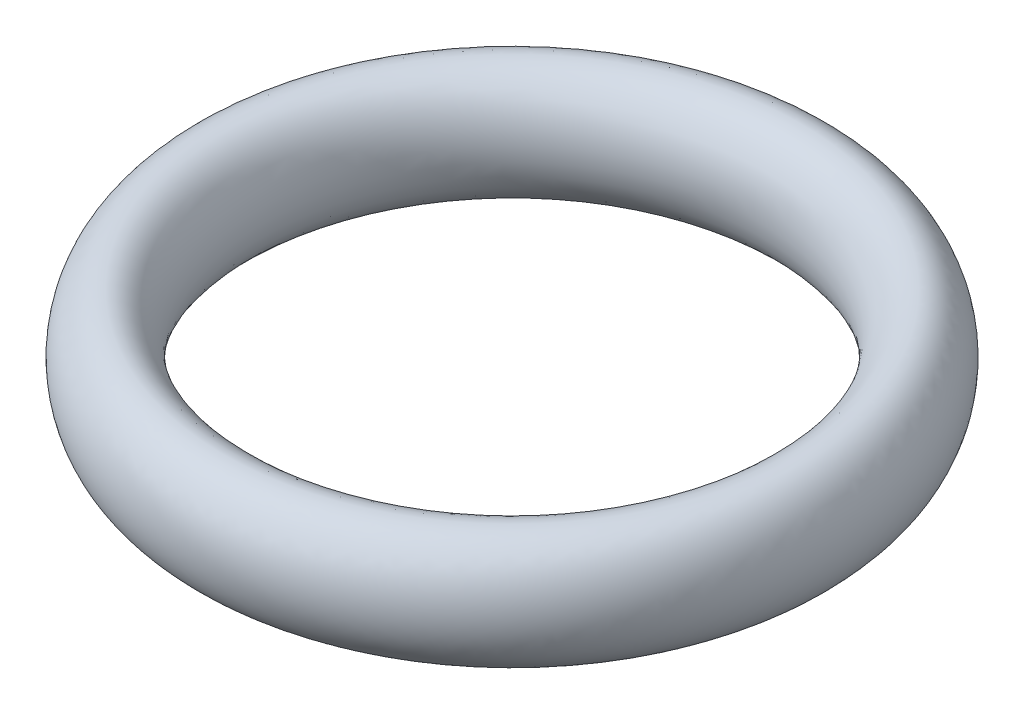
ISO-10303-21;
HEADER;
FILE_DESCRIPTION(('STEP AP214'),'2;1');
FILE_NAME('part.step','',(''),(''),'','','');
FILE_SCHEMA(('AUTOMOTIVE_DESIGN { 1 0 10303 214 1 1 1 1 }'));
ENDSEC;
DATA;
#1=APPLICATION_CONTEXT('core data for automotive mechanical design processes');
#2=APPLICATION_PROTOCOL_DEFINITION('international standard','automotive_design',2000,#1);
#3=PRODUCT_CONTEXT('',#1,'mechanical');
#4=PRODUCT('Part','Part','',(#3));
#5=PRODUCT_RELATED_PRODUCT_CATEGORY('part','',(#4));
#6=PRODUCT_DEFINITION_FORMATION('','',#4);
#7=PRODUCT_DEFINITION_CONTEXT('part definition',#1,'design');
#8=PRODUCT_DEFINITION('design','',#6,#7);
#9=PRODUCT_DEFINITION_SHAPE('','',#8);
#10=(LENGTH_UNIT() NAMED_UNIT(*) SI_UNIT(.MILLI.,.METRE.));
#11=(NAMED_UNIT(*) PLANE_ANGLE_UNIT() SI_UNIT($,.RADIAN.));
#12=(NAMED_UNIT(*) SI_UNIT($,.STERADIAN.) SOLID_ANGLE_UNIT());
#13=UNCERTAINTY_MEASURE_WITH_UNIT(LENGTH_MEASURE(1.E-05),#10,'distance_accuracy_value','');
#14=(GEOMETRIC_REPRESENTATION_CONTEXT(3) GLOBAL_UNCERTAINTY_ASSIGNED_CONTEXT((#13)) GLOBAL_UNIT_ASSIGNED_CONTEXT((#10,
#11,#12)) REPRESENTATION_CONTEXT('',''));
#15=CARTESIAN_POINT('',(0.,0.,0.));
#16=DIRECTION('',(0.,0.,1.));
#17=DIRECTION('',(1.,0.,0.));
#18=AXIS2_PLACEMENT_3D('',#15,#16,#17);
#19=CARTESIAN_POINT('',(4.3561,0.88899999999999,0.));
#20=DIRECTION('',(0.,0.,1.));
#21=DIRECTION('',(0.,1.,0.));
#22=AXIS2_PLACEMENT_3D('',#19,#20,#21);
#23=ELLIPSE('',#22,0.889,0.635);
#24=CARTESIAN_POINT('',(0.,0.,0.));
#25=DIRECTION('',(0.,-1.,0.));
#26=AXIS1_PLACEMENT('',#24,#25);
#27=SURFACE_OF_REVOLUTION('',#23,#26);
#28=ADVANCED_FACE('F29',(),#27,.F.);
#29=CLOSED_SHELL('',(#28));
#30=MANIFOLD_SOLID_BREP('B2',#29);
#31=ADVANCED_BREP_SHAPE_REPRESENTATION('',(#18,#30),#14);
#32=SHAPE_DEFINITION_REPRESENTATION(#9,#31);
ENDSEC;
END-ISO-10303-21;
